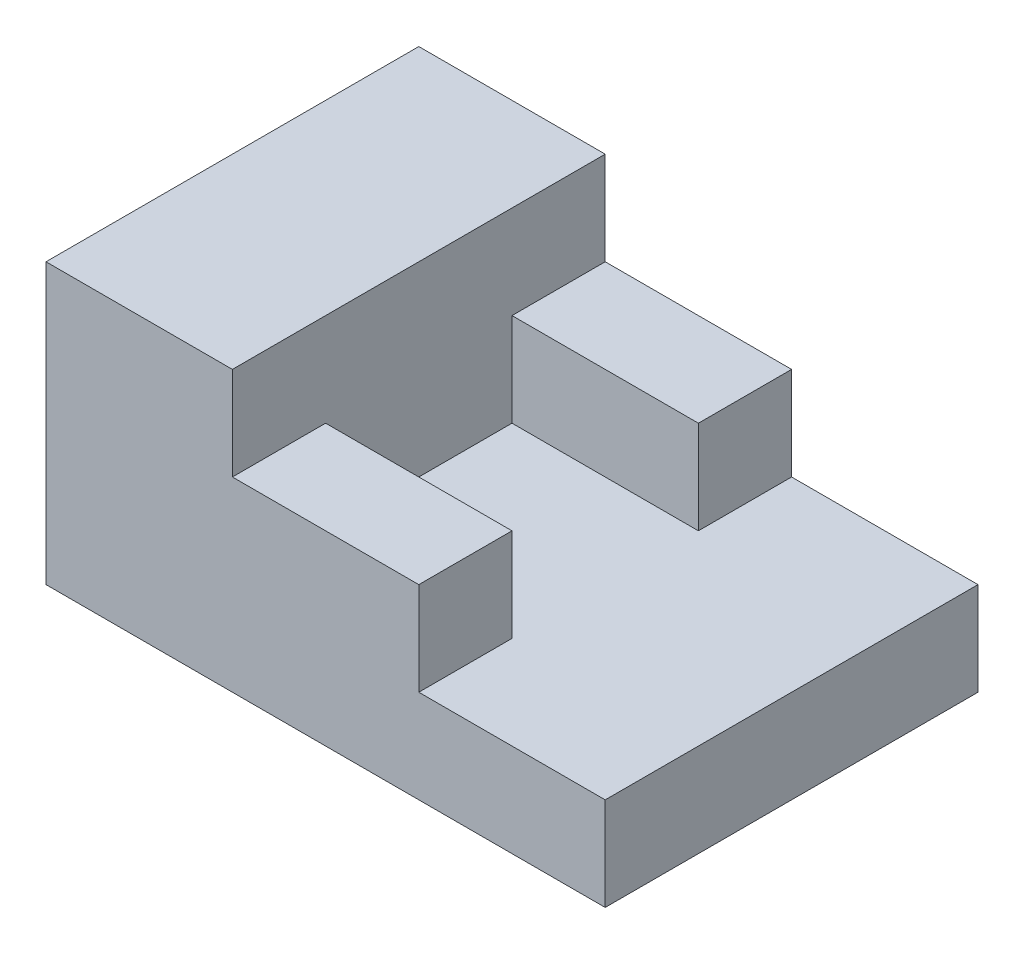
ISO-10303-21;
HEADER;
FILE_DESCRIPTION(('STEP AP214'),'2;1');
FILE_NAME('part.step','',(''),(''),'','','');
FILE_SCHEMA(('AUTOMOTIVE_DESIGN { 1 0 10303 214 1 1 1 1 }'));
ENDSEC;
DATA;
#1=APPLICATION_CONTEXT('core data for automotive mechanical design processes');
#2=APPLICATION_PROTOCOL_DEFINITION('international standard','automotive_design',2000,#1);
#3=PRODUCT_CONTEXT('',#1,'mechanical');
#4=PRODUCT('Part','Part','',(#3));
#5=PRODUCT_RELATED_PRODUCT_CATEGORY('part','',(#4));
#6=PRODUCT_DEFINITION_FORMATION('','',#4);
#7=PRODUCT_DEFINITION_CONTEXT('part definition',#1,'design');
#8=PRODUCT_DEFINITION('design','',#6,#7);
#9=PRODUCT_DEFINITION_SHAPE('','',#8);
#10=(LENGTH_UNIT() NAMED_UNIT(*) SI_UNIT(.MILLI.,.METRE.));
#11=(NAMED_UNIT(*) PLANE_ANGLE_UNIT() SI_UNIT($,.RADIAN.));
#12=(NAMED_UNIT(*) SI_UNIT($,.STERADIAN.) SOLID_ANGLE_UNIT());
#13=UNCERTAINTY_MEASURE_WITH_UNIT(LENGTH_MEASURE(1.E-05),#10,'distance_accuracy_value','');
#14=(GEOMETRIC_REPRESENTATION_CONTEXT(3) GLOBAL_UNCERTAINTY_ASSIGNED_CONTEXT((#13)) GLOBAL_UNIT_ASSIGNED_CONTEXT((#10,
#11,#12)) REPRESENTATION_CONTEXT('',''));
#15=CARTESIAN_POINT('',(0.,0.,0.));
#16=DIRECTION('',(0.,0.,1.));
#17=DIRECTION('',(1.,0.,0.));
#18=AXIS2_PLACEMENT_3D('',#15,#16,#17);
#19=CARTESIAN_POINT('',(0.,10.,-20.));
#20=DIRECTION('',(0.,-1.,0.));
#21=DIRECTION('',(0.,0.,-1.));
#22=AXIS2_PLACEMENT_3D('',#19,#20,#21);
#23=PLANE('',#22);
#24=DIRECTION('',(0.,0.,1.));
#25=VECTOR('',#24,1.);
#26=CARTESIAN_POINT('',(20.,10.,-20.));
#27=LINE('',#26,#25);
#28=CARTESIAN_POINT('',(20.,10.,-5.));
#29=VERTEX_POINT('',#28);
#30=CARTESIAN_POINT('',(20.,10.,0.));
#31=VERTEX_POINT('',#30);
#32=EDGE_CURVE('E173',#29,#31,#27,.T.);
#33=ORIENTED_EDGE('',*,*,#32,.F.);
#34=DIRECTION('',(1.,0.,0.));
#35=VECTOR('',#34,1.);
#36=CARTESIAN_POINT('',(10.,10.,-5.));
#37=LINE('',#36,#35);
#38=CARTESIAN_POINT('',(10.,10.,-5.));
#39=VERTEX_POINT('',#38);
#40=EDGE_CURVE('E210',#39,#29,#37,.T.);
#41=ORIENTED_EDGE('',*,*,#40,.F.);
#42=DIRECTION('',(0.,0.,1.));
#43=VECTOR('',#42,1.);
#44=CARTESIAN_POINT('',(10.,10.,-20.));
#45=LINE('',#44,#43);
#46=CARTESIAN_POINT('',(10.,10.,0.));
#47=VERTEX_POINT('',#46);
#48=EDGE_CURVE('E169',#39,#47,#45,.T.);
#49=ORIENTED_EDGE('',*,*,#48,.T.);
#50=DIRECTION('',(1.,0.,0.));
#51=VECTOR('',#50,1.);
#52=CARTESIAN_POINT('',(0.,10.,0.));
#53=LINE('',#52,#51);
#54=EDGE_CURVE('E158',#47,#31,#53,.T.);
#55=ORIENTED_EDGE('',*,*,#54,.T.);
#56=EDGE_LOOP('',(#33,#41,#49,#55));
#57=FACE_BOUND('',#56,.T.);
#58=ADVANCED_FACE('F33',(#57),#23,.F.);
#59=CARTESIAN_POINT('',(20.,0.,-20.));
#60=DIRECTION('',(1.,0.,0.));
#61=DIRECTION('',(0.,0.,-1.));
#62=AXIS2_PLACEMENT_3D('',#59,#60,#61);
#63=PLANE('',#62);
#64=DIRECTION('',(0.,1.,0.));
#65=VECTOR('',#64,1.);
#66=CARTESIAN_POINT('',(20.,-9.14213562373095,-5.));
#67=LINE('',#66,#65);
#68=CARTESIAN_POINT('',(20.,5.,-5.));
#69=VERTEX_POINT('',#68);
#70=EDGE_CURVE('E212',#69,#29,#67,.T.);
#71=ORIENTED_EDGE('',*,*,#70,.T.);
#72=ORIENTED_EDGE('',*,*,#32,.T.);
#73=DIRECTION('',(0.,1.,0.));
#74=VECTOR('',#73,1.);
#75=CARTESIAN_POINT('',(20.,0.,0.));
#76=LINE('',#75,#74);
#77=CARTESIAN_POINT('',(20.,5.,0.));
#78=VERTEX_POINT('',#77);
#79=EDGE_CURVE('E155',#78,#31,#76,.T.);
#80=ORIENTED_EDGE('',*,*,#79,.F.);
#81=DIRECTION('',(0.,0.,1.));
#82=VECTOR('',#81,1.);
#83=CARTESIAN_POINT('',(20.,5.,-20.));
#84=LINE('',#83,#82);
#85=EDGE_CURVE('E176',#69,#78,#84,.T.);
#86=ORIENTED_EDGE('',*,*,#85,.F.);
#87=EDGE_LOOP('',(#71,#72,#80,#86));
#88=FACE_BOUND('',#87,.T.);
#89=ADVANCED_FACE('F229',(#88),#63,.T.);
#90=CARTESIAN_POINT('',(0.,0.,-20.));
#91=DIRECTION('',(0.,-1.,0.));
#92=DIRECTION('',(0.,0.,-1.));
#93=AXIS2_PLACEMENT_3D('',#90,#91,#92);
#94=PLANE('',#93);
#95=DIRECTION('',(1.,0.,0.));
#96=VECTOR('',#95,1.);
#97=CARTESIAN_POINT('',(0.,0.,0.));
#98=LINE('',#97,#96);
#99=CARTESIAN_POINT('',(0.,0.,0.));
#100=VERTEX_POINT('',#99);
#101=CARTESIAN_POINT('',(30.,0.,0.));
#102=VERTEX_POINT('',#101);
#103=EDGE_CURVE('E145',#100,#102,#98,.T.);
#104=ORIENTED_EDGE('',*,*,#103,.F.);
#105=DIRECTION('',(0.,0.,1.));
#106=VECTOR('',#105,1.);
#107=CARTESIAN_POINT('',(0.,0.,-20.));
#108=LINE('',#107,#106);
#109=CARTESIAN_POINT('',(0.,0.,-20.));
#110=VERTEX_POINT('',#109);
#111=EDGE_CURVE('E11',#110,#100,#108,.T.);
#112=ORIENTED_EDGE('',*,*,#111,.F.);
#113=DIRECTION('',(1.,0.,0.));
#114=VECTOR('',#113,1.);
#115=CARTESIAN_POINT('',(0.,0.,-20.));
#116=LINE('',#115,#114);
#117=CARTESIAN_POINT('',(30.,0.,-20.));
#118=VERTEX_POINT('',#117);
#119=EDGE_CURVE('E165',#110,#118,#116,.T.);
#120=ORIENTED_EDGE('',*,*,#119,.T.);
#121=DIRECTION('',(0.,0.,1.));
#122=VECTOR('',#121,1.);
#123=CARTESIAN_POINT('',(30.,0.,-20.));
#124=LINE('',#123,#122);
#125=EDGE_CURVE('E37',#118,#102,#124,.T.);
#126=ORIENTED_EDGE('',*,*,#125,.T.);
#127=EDGE_LOOP('',(#104,#112,#120,#126));
#128=FACE_BOUND('',#127,.T.);
#129=ADVANCED_FACE('F35',(#128),#94,.T.);
#130=CARTESIAN_POINT('',(0.,0.,-20.));
#131=DIRECTION('',(1.,0.,0.));
#132=DIRECTION('',(0.,0.,-1.));
#133=AXIS2_PLACEMENT_3D('',#130,#131,#132);
#134=PLANE('',#133);
#135=DIRECTION('',(0.,1.,0.));
#136=VECTOR('',#135,1.);
#137=CARTESIAN_POINT('',(0.,0.,0.));
#138=LINE('',#137,#136);
#139=CARTESIAN_POINT('',(0.,15.,0.));
#140=VERTEX_POINT('',#139);
#141=EDGE_CURVE('E164',#100,#140,#138,.T.);
#142=ORIENTED_EDGE('',*,*,#141,.T.);
#143=DIRECTION('',(0.,0.,1.));
#144=VECTOR('',#143,1.);
#145=CARTESIAN_POINT('',(0.,15.,-20.));
#146=LINE('',#145,#144);
#147=CARTESIAN_POINT('',(0.,15.,-20.));
#148=VERTEX_POINT('',#147);
#149=EDGE_CURVE('E42',#148,#140,#146,.T.);
#150=ORIENTED_EDGE('',*,*,#149,.F.);
#151=DIRECTION('',(0.,1.,0.));
#152=VECTOR('',#151,1.);
#153=CARTESIAN_POINT('',(0.,0.,-20.));
#154=LINE('',#153,#152);
#155=EDGE_CURVE('E119',#110,#148,#154,.T.);
#156=ORIENTED_EDGE('',*,*,#155,.F.);
#157=ORIENTED_EDGE('',*,*,#111,.T.);
#158=EDGE_LOOP('',(#142,#150,#156,#157));
#159=FACE_BOUND('',#158,.T.);
#160=ADVANCED_FACE('F183',(#159),#134,.F.);
#161=CARTESIAN_POINT('',(0.,15.,-20.));
#162=DIRECTION('',(0.,-1.,0.));
#163=DIRECTION('',(0.,0.,-1.));
#164=AXIS2_PLACEMENT_3D('',#161,#162,#163);
#165=PLANE('',#164);
#166=DIRECTION('',(1.,0.,0.));
#167=VECTOR('',#166,1.);
#168=CARTESIAN_POINT('',(0.,15.,0.));
#169=LINE('',#168,#167);
#170=CARTESIAN_POINT('',(10.,15.,0.));
#171=VERTEX_POINT('',#170);
#172=EDGE_CURVE('E128',#140,#171,#169,.T.);
#173=ORIENTED_EDGE('',*,*,#172,.T.);
#174=DIRECTION('',(0.,0.,1.));
#175=VECTOR('',#174,1.);
#176=CARTESIAN_POINT('',(10.,15.,-20.));
#177=LINE('',#176,#175);
#178=CARTESIAN_POINT('',(10.,15.,-20.));
#179=VERTEX_POINT('',#178);
#180=EDGE_CURVE('E125',#179,#171,#177,.T.);
#181=ORIENTED_EDGE('',*,*,#180,.F.);
#182=DIRECTION('',(1.,0.,0.));
#183=VECTOR('',#182,1.);
#184=CARTESIAN_POINT('',(0.,15.,-20.));
#185=LINE('',#184,#183);
#186=EDGE_CURVE('E113',#148,#179,#185,.T.);
#187=ORIENTED_EDGE('',*,*,#186,.F.);
#188=ORIENTED_EDGE('',*,*,#149,.T.);
#189=EDGE_LOOP('',(#173,#181,#187,#188));
#190=FACE_BOUND('',#189,.T.);
#191=ADVANCED_FACE('F126',(#190),#165,.F.);
#192=CARTESIAN_POINT('',(10.,0.,-20.));
#193=DIRECTION('',(1.,0.,0.));
#194=DIRECTION('',(0.,0.,-1.));
#195=AXIS2_PLACEMENT_3D('',#192,#193,#194);
#196=PLANE('',#195);
#197=DIRECTION('',(0.,1.,0.));
#198=VECTOR('',#197,1.);
#199=CARTESIAN_POINT('',(10.,0.,0.));
#200=LINE('',#199,#198);
#201=EDGE_CURVE('E161',#47,#171,#200,.T.);
#202=ORIENTED_EDGE('',*,*,#201,.F.);
#203=ORIENTED_EDGE('',*,*,#48,.F.);
#204=DIRECTION('',(0.,1.,0.));
#205=VECTOR('',#204,1.);
#206=CARTESIAN_POINT('',(10.,-9.14213562373095,-5.));
#207=LINE('',#206,#205);
#208=CARTESIAN_POINT('',(10.,5.,-5.));
#209=VERTEX_POINT('',#208);
#210=EDGE_CURVE('E149',#209,#39,#207,.T.);
#211=ORIENTED_EDGE('',*,*,#210,.F.);
#212=DIRECTION('',(0.,0.,1.));
#213=VECTOR('',#212,1.);
#214=CARTESIAN_POINT('',(10.,5.,-15.));
#215=LINE('',#214,#213);
#216=CARTESIAN_POINT('',(10.,5.,-15.));
#217=VERTEX_POINT('',#216);
#218=EDGE_CURVE('E217',#217,#209,#215,.T.);
#219=ORIENTED_EDGE('',*,*,#218,.F.);
#220=DIRECTION('',(0.,1.,0.));
#221=VECTOR('',#220,1.);
#222=CARTESIAN_POINT('',(10.,-9.14213562373095,-15.));
#223=LINE('',#222,#221);
#224=CARTESIAN_POINT('',(10.,10.,-15.));
#225=VERTEX_POINT('',#224);
#226=EDGE_CURVE('E219',#217,#225,#223,.T.);
#227=ORIENTED_EDGE('',*,*,#226,.T.);
#228=CARTESIAN_POINT('',(10.,10.,-20.));
#229=VERTEX_POINT('',#228);
#230=EDGE_CURVE('E132',#229,#225,#45,.T.);
#231=ORIENTED_EDGE('',*,*,#230,.F.);
#232=DIRECTION('',(0.,1.,0.));
#233=VECTOR('',#232,1.);
#234=CARTESIAN_POINT('',(10.,0.,-20.));
#235=LINE('',#234,#233);
#236=EDGE_CURVE('E118',#229,#179,#235,.T.);
#237=ORIENTED_EDGE('',*,*,#236,.T.);
#238=ORIENTED_EDGE('',*,*,#180,.T.);
#239=EDGE_LOOP('',(#202,#203,#211,#219,#227,#231,#237,#238));
#240=FACE_BOUND('',#239,.T.);
#241=ADVANCED_FACE('F134',(#240),#196,.T.);
#242=ORIENTED_EDGE('',*,*,#230,.T.);
#243=DIRECTION('',(-1.,0.,0.));
#244=VECTOR('',#243,1.);
#245=CARTESIAN_POINT('',(10.,10.,-15.));
#246=LINE('',#245,#244);
#247=CARTESIAN_POINT('',(20.,10.,-15.));
#248=VERTEX_POINT('',#247);
#249=EDGE_CURVE('E203',#248,#225,#246,.T.);
#250=ORIENTED_EDGE('',*,*,#249,.F.);
#251=CARTESIAN_POINT('',(20.,10.,-20.));
#252=VERTEX_POINT('',#251);
#253=EDGE_CURVE('E170',#252,#248,#27,.T.);
#254=ORIENTED_EDGE('',*,*,#253,.F.);
#255=DIRECTION('',(1.,0.,0.));
#256=VECTOR('',#255,1.);
#257=CARTESIAN_POINT('',(0.,10.,-20.));
#258=LINE('',#257,#256);
#259=EDGE_CURVE('E138',#229,#252,#258,.T.);
#260=ORIENTED_EDGE('',*,*,#259,.F.);
#261=EDGE_LOOP('',(#242,#250,#254,#260));
#262=FACE_BOUND('',#261,.T.);
#263=ADVANCED_FACE('F201',(#262),#23,.F.);
#264=DIRECTION('',(0.,1.,0.));
#265=VECTOR('',#264,1.);
#266=CARTESIAN_POINT('',(20.,-9.14213562373095,-15.));
#267=LINE('',#266,#265);
#268=CARTESIAN_POINT('',(20.,5.,-15.));
#269=VERTEX_POINT('',#268);
#270=EDGE_CURVE('E223',#269,#248,#267,.T.);
#271=ORIENTED_EDGE('',*,*,#270,.F.);
#272=CARTESIAN_POINT('',(20.,5.,-20.));
#273=VERTEX_POINT('',#272);
#274=EDGE_CURVE('E174',#273,#269,#84,.T.);
#275=ORIENTED_EDGE('',*,*,#274,.F.);
#276=DIRECTION('',(0.,1.,0.));
#277=VECTOR('',#276,1.);
#278=CARTESIAN_POINT('',(20.,0.,-20.));
#279=LINE('',#278,#277);
#280=EDGE_CURVE('E140',#273,#252,#279,.T.);
#281=ORIENTED_EDGE('',*,*,#280,.T.);
#282=ORIENTED_EDGE('',*,*,#253,.T.);
#283=EDGE_LOOP('',(#271,#275,#281,#282));
#284=FACE_BOUND('',#283,.T.);
#285=ADVANCED_FACE('F195',(#284),#63,.T.);
#286=CARTESIAN_POINT('',(0.,5.,-20.));
#287=DIRECTION('',(0.,-1.,0.));
#288=DIRECTION('',(0.,0.,-1.));
#289=AXIS2_PLACEMENT_3D('',#286,#287,#288);
#290=PLANE('',#289);
#291=DIRECTION('',(1.,0.,0.));
#292=VECTOR('',#291,1.);
#293=CARTESIAN_POINT('',(0.,5.,0.));
#294=LINE('',#293,#292);
#295=CARTESIAN_POINT('',(30.,5.,0.));
#296=VERTEX_POINT('',#295);
#297=EDGE_CURVE('E152',#78,#296,#294,.T.);
#298=ORIENTED_EDGE('',*,*,#297,.T.);
#299=DIRECTION('',(0.,0.,1.));
#300=VECTOR('',#299,1.);
#301=CARTESIAN_POINT('',(30.,5.,-20.));
#302=LINE('',#301,#300);
#303=CARTESIAN_POINT('',(30.,5.,-20.));
#304=VERTEX_POINT('',#303);
#305=EDGE_CURVE('E177',#304,#296,#302,.T.);
#306=ORIENTED_EDGE('',*,*,#305,.F.);
#307=DIRECTION('',(1.,0.,0.));
#308=VECTOR('',#307,1.);
#309=CARTESIAN_POINT('',(0.,5.,-20.));
#310=LINE('',#309,#308);
#311=EDGE_CURVE('E186',#273,#304,#310,.T.);
#312=ORIENTED_EDGE('',*,*,#311,.F.);
#313=ORIENTED_EDGE('',*,*,#274,.T.);
#314=DIRECTION('',(-1.,0.,0.));
#315=VECTOR('',#314,1.);
#316=CARTESIAN_POINT('',(10.,5.,-15.));
#317=LINE('',#316,#315);
#318=EDGE_CURVE('E220',#269,#217,#317,.T.);
#319=ORIENTED_EDGE('',*,*,#318,.T.);
#320=ORIENTED_EDGE('',*,*,#218,.T.);
#321=DIRECTION('',(1.,0.,0.));
#322=VECTOR('',#321,1.);
#323=CARTESIAN_POINT('',(10.,5.,-5.));
#324=LINE('',#323,#322);
#325=EDGE_CURVE('E50',#209,#69,#324,.T.);
#326=ORIENTED_EDGE('',*,*,#325,.T.);
#327=ORIENTED_EDGE('',*,*,#85,.T.);
#328=EDGE_LOOP('',(#298,#306,#312,#313,#319,#320,#326,#327));
#329=FACE_BOUND('',#328,.T.);
#330=ADVANCED_FACE('F237',(#329),#290,.F.);
#331=CARTESIAN_POINT('',(30.,0.,-20.));
#332=DIRECTION('',(1.,0.,0.));
#333=DIRECTION('',(0.,0.,-1.));
#334=AXIS2_PLACEMENT_3D('',#331,#332,#333);
#335=PLANE('',#334);
#336=DIRECTION('',(0.,1.,0.));
#337=VECTOR('',#336,1.);
#338=CARTESIAN_POINT('',(30.,0.,0.));
#339=LINE('',#338,#337);
#340=EDGE_CURVE('E148',#102,#296,#339,.T.);
#341=ORIENTED_EDGE('',*,*,#340,.F.);
#342=ORIENTED_EDGE('',*,*,#125,.F.);
#343=DIRECTION('',(0.,1.,0.));
#344=VECTOR('',#343,1.);
#345=CARTESIAN_POINT('',(30.,0.,-20.));
#346=LINE('',#345,#344);
#347=EDGE_CURVE('E184',#118,#304,#346,.T.);
#348=ORIENTED_EDGE('',*,*,#347,.T.);
#349=ORIENTED_EDGE('',*,*,#305,.T.);
#350=EDGE_LOOP('',(#341,#342,#348,#349));
#351=FACE_BOUND('',#350,.T.);
#352=ADVANCED_FACE('F179',(#351),#335,.T.);
#353=CARTESIAN_POINT('',(0.,0.,-20.));
#354=DIRECTION('',(0.,0.,1.));
#355=DIRECTION('',(1.,0.,0.));
#356=AXIS2_PLACEMENT_3D('',#353,#354,#355);
#357=PLANE('',#356);
#358=ORIENTED_EDGE('',*,*,#119,.F.);
#359=ORIENTED_EDGE('',*,*,#155,.T.);
#360=ORIENTED_EDGE('',*,*,#186,.T.);
#361=ORIENTED_EDGE('',*,*,#236,.F.);
#362=ORIENTED_EDGE('',*,*,#259,.T.);
#363=ORIENTED_EDGE('',*,*,#280,.F.);
#364=ORIENTED_EDGE('',*,*,#311,.T.);
#365=ORIENTED_EDGE('',*,*,#347,.F.);
#366=EDGE_LOOP('',(#358,#359,#360,#361,#362,#363,#364,#365));
#367=FACE_BOUND('',#366,.T.);
#368=ADVANCED_FACE('F116',(#367),#357,.F.);
#369=CARTESIAN_POINT('',(0.,0.,0.));
#370=DIRECTION('',(0.,0.,1.));
#371=DIRECTION('',(1.,0.,0.));
#372=AXIS2_PLACEMENT_3D('',#369,#370,#371);
#373=PLANE('',#372);
#374=ORIENTED_EDGE('',*,*,#103,.T.);
#375=ORIENTED_EDGE('',*,*,#340,.T.);
#376=ORIENTED_EDGE('',*,*,#297,.F.);
#377=ORIENTED_EDGE('',*,*,#79,.T.);
#378=ORIENTED_EDGE('',*,*,#54,.F.);
#379=ORIENTED_EDGE('',*,*,#201,.T.);
#380=ORIENTED_EDGE('',*,*,#172,.F.);
#381=ORIENTED_EDGE('',*,*,#141,.F.);
#382=EDGE_LOOP('',(#374,#375,#376,#377,#378,#379,#380,#381));
#383=FACE_BOUND('',#382,.T.);
#384=ADVANCED_FACE('F182',(#383),#373,.T.);
#385=CARTESIAN_POINT('',(10.,-9.14213562373095,-5.));
#386=DIRECTION('',(0.,0.,1.));
#387=DIRECTION('',(1.,0.,0.));
#388=AXIS2_PLACEMENT_3D('',#385,#386,#387);
#389=PLANE('',#388);
#390=ORIENTED_EDGE('',*,*,#210,.T.);
#391=ORIENTED_EDGE('',*,*,#40,.T.);
#392=ORIENTED_EDGE('',*,*,#70,.F.);
#393=ORIENTED_EDGE('',*,*,#325,.F.);
#394=EDGE_LOOP('',(#390,#391,#392,#393));
#395=FACE_BOUND('',#394,.T.);
#396=ADVANCED_FACE('F249',(#395),#389,.F.);
#397=CARTESIAN_POINT('',(10.,-9.14213562373095,-15.));
#398=DIRECTION('',(0.,0.,-1.));
#399=DIRECTION('',(-1.,0.,0.));
#400=AXIS2_PLACEMENT_3D('',#397,#398,#399);
#401=PLANE('',#400);
#402=ORIENTED_EDGE('',*,*,#270,.T.);
#403=ORIENTED_EDGE('',*,*,#249,.T.);
#404=ORIENTED_EDGE('',*,*,#226,.F.);
#405=ORIENTED_EDGE('',*,*,#318,.F.);
#406=EDGE_LOOP('',(#402,#403,#404,#405));
#407=FACE_BOUND('',#406,.T.);
#408=ADVANCED_FACE('F247',(#407),#401,.F.);
#409=CLOSED_SHELL('',(#58,#89,#129,#160,#191,#241,#263,#285,#330,#352,#368,#384,#396,#408));
#410=MANIFOLD_SOLID_BREP('B2',#409);
#411=ADVANCED_BREP_SHAPE_REPRESENTATION('',(#18,#410),#14);
#412=SHAPE_DEFINITION_REPRESENTATION(#9,#411);
ENDSEC;
END-ISO-10303-21;
